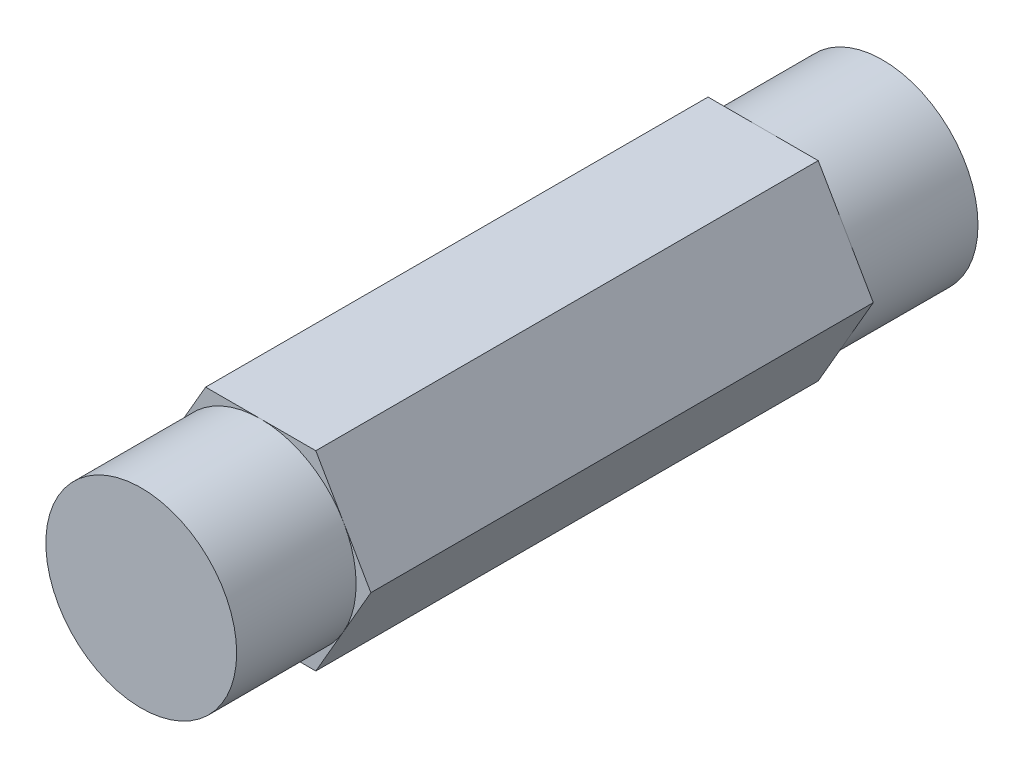
ISO-10303-21;
HEADER;
FILE_DESCRIPTION(('STEP AP214'),'2;1');
FILE_NAME('part.step','',(''),(''),'','','');
FILE_SCHEMA(('AUTOMOTIVE_DESIGN { 1 0 10303 214 1 1 1 1 }'));
ENDSEC;
DATA;
#1=APPLICATION_CONTEXT('core data for automotive mechanical design processes');
#2=APPLICATION_PROTOCOL_DEFINITION('international standard','automotive_design',2000,#1);
#3=PRODUCT_CONTEXT('',#1,'mechanical');
#4=PRODUCT('Part','Part','',(#3));
#5=PRODUCT_RELATED_PRODUCT_CATEGORY('part','',(#4));
#6=PRODUCT_DEFINITION_FORMATION('','',#4);
#7=PRODUCT_DEFINITION_CONTEXT('part definition',#1,'design');
#8=PRODUCT_DEFINITION('design','',#6,#7);
#9=PRODUCT_DEFINITION_SHAPE('','',#8);
#10=(LENGTH_UNIT() NAMED_UNIT(*) SI_UNIT(.MILLI.,.METRE.));
#11=(NAMED_UNIT(*) PLANE_ANGLE_UNIT() SI_UNIT($,.RADIAN.));
#12=(NAMED_UNIT(*) SI_UNIT($,.STERADIAN.) SOLID_ANGLE_UNIT());
#13=UNCERTAINTY_MEASURE_WITH_UNIT(LENGTH_MEASURE(1.E-05),#10,'distance_accuracy_value','');
#14=(GEOMETRIC_REPRESENTATION_CONTEXT(3) GLOBAL_UNCERTAINTY_ASSIGNED_CONTEXT((#13)) GLOBAL_UNIT_ASSIGNED_CONTEXT((#10,
#11,#12)) REPRESENTATION_CONTEXT('',''));
#15=CARTESIAN_POINT('',(0.,0.,0.));
#16=DIRECTION('',(0.,0.,1.));
#17=DIRECTION('',(1.,0.,0.));
#18=AXIS2_PLACEMENT_3D('',#15,#16,#17);
#19=CARTESIAN_POINT('',(0.,-6.35,24.66975));
#20=DIRECTION('',(0.,1.,0.));
#21=DIRECTION('',(-1.,0.,0.));
#22=AXIS2_PLACEMENT_3D('',#19,#20,#21);
#23=PLANE('',#22);
#24=DIRECTION('',(-1.,0.,0.));
#25=VECTOR('',#24,1.);
#26=CARTESIAN_POINT('',(0.,-6.35,-16.71955));
#27=LINE('',#26,#25);
#28=CARTESIAN_POINT('',(3.66617420935412,-6.35,-16.71955));
#29=VERTEX_POINT('',#28);
#30=CARTESIAN_POINT('',(0.,-6.35,-16.71955));
#31=VERTEX_POINT('',#30);
#32=EDGE_CURVE('E315',#29,#31,#27,.T.);
#33=ORIENTED_EDGE('',*,*,#32,.F.);
#34=DIRECTION('',(0.,0.,-1.));
#35=VECTOR('',#34,1.);
#36=CARTESIAN_POINT('',(3.66617420935412,-6.35,24.66975));
#37=LINE('',#36,#35);
#38=CARTESIAN_POINT('',(3.66617420935412,-6.35,16.71955));
#39=VERTEX_POINT('',#38);
#40=EDGE_CURVE('E228',#39,#29,#37,.T.);
#41=ORIENTED_EDGE('',*,*,#40,.F.);
#42=DIRECTION('',(1.,0.,0.));
#43=VECTOR('',#42,1.);
#44=CARTESIAN_POINT('',(0.,-6.35,16.71955));
#45=LINE('',#44,#43);
#46=CARTESIAN_POINT('',(0.,-6.35,16.71955));
#47=VERTEX_POINT('',#46);
#48=EDGE_CURVE('E207',#47,#39,#45,.T.);
#49=ORIENTED_EDGE('',*,*,#48,.F.);
#50=CARTESIAN_POINT('',(-3.66617420935412,-6.35,16.71955));
#51=VERTEX_POINT('',#50);
#52=EDGE_CURVE('E210',#51,#47,#45,.T.);
#53=ORIENTED_EDGE('',*,*,#52,.F.);
#54=DIRECTION('',(0.,0.,-1.));
#55=VECTOR('',#54,1.);
#56=CARTESIAN_POINT('',(-3.66617420935412,-6.35,24.66975));
#57=LINE('',#56,#55);
#58=CARTESIAN_POINT('',(-3.66617420935412,-6.35,-16.71955));
#59=VERTEX_POINT('',#58);
#60=EDGE_CURVE('E211',#51,#59,#57,.T.);
#61=ORIENTED_EDGE('',*,*,#60,.T.);
#62=EDGE_CURVE('E305',#31,#59,#27,.T.);
#63=ORIENTED_EDGE('',*,*,#62,.F.);
#64=EDGE_LOOP('',(#33,#41,#49,#53,#61,#63));
#65=FACE_BOUND('',#64,.T.);
#66=ADVANCED_FACE('F49',(#65),#23,.F.);
#67=CARTESIAN_POINT('',(5.49926131403119,-3.175,24.66975));
#68=DIRECTION('',(-0.866025403784439,0.5,0.));
#69=DIRECTION('',(-0.5,-0.866025403784439,0.));
#70=AXIS2_PLACEMENT_3D('',#67,#68,#69);
#71=PLANE('',#70);
#72=DIRECTION('',(-0.5,-0.866025403784439,0.));
#73=VECTOR('',#72,1.);
#74=CARTESIAN_POINT('',(5.49926131403119,-3.175,-16.71955));
#75=LINE('',#74,#73);
#76=CARTESIAN_POINT('',(7.33234841870825,0.,-16.71955));
#77=VERTEX_POINT('',#76);
#78=CARTESIAN_POINT('',(5.49926131403119,-3.175,-16.71955));
#79=VERTEX_POINT('',#78);
#80=EDGE_CURVE('E160',#77,#79,#75,.T.);
#81=ORIENTED_EDGE('',*,*,#80,.F.);
#82=DIRECTION('',(0.,0.,-1.));
#83=VECTOR('',#82,1.);
#84=CARTESIAN_POINT('',(7.33234841870825,0.,24.66975));
#85=LINE('',#84,#83);
#86=CARTESIAN_POINT('',(7.33234841870825,0.,16.71955));
#87=VERTEX_POINT('',#86);
#88=EDGE_CURVE('E178',#87,#77,#85,.T.);
#89=ORIENTED_EDGE('',*,*,#88,.F.);
#90=DIRECTION('',(0.5,0.866025403784439,0.));
#91=VECTOR('',#90,1.);
#92=CARTESIAN_POINT('',(5.49926131403119,-3.175,16.71955));
#93=LINE('',#92,#91);
#94=CARTESIAN_POINT('',(5.49926131403119,-3.175,16.71955));
#95=VERTEX_POINT('',#94);
#96=EDGE_CURVE('E203',#95,#87,#93,.T.);
#97=ORIENTED_EDGE('',*,*,#96,.F.);
#98=EDGE_CURVE('E206',#39,#95,#93,.T.);
#99=ORIENTED_EDGE('',*,*,#98,.F.);
#100=ORIENTED_EDGE('',*,*,#40,.T.);
#101=EDGE_CURVE('E185',#79,#29,#75,.T.);
#102=ORIENTED_EDGE('',*,*,#101,.F.);
#103=EDGE_LOOP('',(#81,#89,#97,#99,#100,#102));
#104=FACE_BOUND('',#103,.T.);
#105=ADVANCED_FACE('F326',(#104),#71,.F.);
#106=CARTESIAN_POINT('',(5.49926131403119,3.175,24.66975));
#107=DIRECTION('',(-0.866025403784439,-0.5,0.));
#108=DIRECTION('',(0.5,-0.866025403784439,0.));
#109=AXIS2_PLACEMENT_3D('',#106,#107,#108);
#110=PLANE('',#109);
#111=DIRECTION('',(0.5,-0.866025403784439,0.));
#112=VECTOR('',#111,1.);
#113=CARTESIAN_POINT('',(5.49926131403119,3.175,-16.71955));
#114=LINE('',#113,#112);
#115=CARTESIAN_POINT('',(3.66617420935412,6.35,-16.71955));
#116=VERTEX_POINT('',#115);
#117=CARTESIAN_POINT('',(5.49926131403119,3.175,-16.71955));
#118=VERTEX_POINT('',#117);
#119=EDGE_CURVE('E140',#116,#118,#114,.T.);
#120=ORIENTED_EDGE('',*,*,#119,.F.);
#121=DIRECTION('',(0.,0.,-1.));
#122=VECTOR('',#121,1.);
#123=CARTESIAN_POINT('',(3.66617420935412,6.35,24.66975));
#124=LINE('',#123,#122);
#125=CARTESIAN_POINT('',(3.66617420935412,6.35,16.71955));
#126=VERTEX_POINT('',#125);
#127=EDGE_CURVE('E223',#126,#116,#124,.T.);
#128=ORIENTED_EDGE('',*,*,#127,.F.);
#129=DIRECTION('',(-0.5,0.866025403784439,0.));
#130=VECTOR('',#129,1.);
#131=CARTESIAN_POINT('',(5.49926131403119,3.175,16.71955));
#132=LINE('',#131,#130);
#133=CARTESIAN_POINT('',(5.49926131403119,3.175,16.71955));
#134=VERTEX_POINT('',#133);
#135=EDGE_CURVE('E199',#134,#126,#132,.T.);
#136=ORIENTED_EDGE('',*,*,#135,.F.);
#137=EDGE_CURVE('E202',#87,#134,#132,.T.);
#138=ORIENTED_EDGE('',*,*,#137,.F.);
#139=ORIENTED_EDGE('',*,*,#88,.T.);
#140=EDGE_CURVE('E153',#118,#77,#114,.T.);
#141=ORIENTED_EDGE('',*,*,#140,.F.);
#142=EDGE_LOOP('',(#120,#128,#136,#138,#139,#141));
#143=FACE_BOUND('',#142,.T.);
#144=ADVANCED_FACE('F175',(#143),#110,.F.);
#145=CARTESIAN_POINT('',(0.,6.35,24.66975));
#146=DIRECTION('',(0.,-1.,0.));
#147=DIRECTION('',(1.,0.,0.));
#148=AXIS2_PLACEMENT_3D('',#145,#146,#147);
#149=PLANE('',#148);
#150=DIRECTION('',(1.,0.,0.));
#151=VECTOR('',#150,1.);
#152=CARTESIAN_POINT('',(0.,6.35,-16.71955));
#153=LINE('',#152,#151);
#154=CARTESIAN_POINT('',(-3.66617420935412,6.35,-16.71955));
#155=VERTEX_POINT('',#154);
#156=CARTESIAN_POINT('',(0.,6.35,-16.71955));
#157=VERTEX_POINT('',#156);
#158=EDGE_CURVE('E182',#155,#157,#153,.T.);
#159=ORIENTED_EDGE('',*,*,#158,.F.);
#160=DIRECTION('',(0.,0.,-1.));
#161=VECTOR('',#160,1.);
#162=CARTESIAN_POINT('',(-3.66617420935412,6.35,24.66975));
#163=LINE('',#162,#161);
#164=CARTESIAN_POINT('',(-3.66617420935412,6.35,16.71955));
#165=VERTEX_POINT('',#164);
#166=EDGE_CURVE('E219',#165,#155,#163,.T.);
#167=ORIENTED_EDGE('',*,*,#166,.F.);
#168=DIRECTION('',(-1.,0.,0.));
#169=VECTOR('',#168,1.);
#170=CARTESIAN_POINT('',(0.,6.35,16.71955));
#171=LINE('',#170,#169);
#172=CARTESIAN_POINT('',(0.,6.35,16.71955));
#173=VERTEX_POINT('',#172);
#174=EDGE_CURVE('E195',#173,#165,#171,.T.);
#175=ORIENTED_EDGE('',*,*,#174,.F.);
#176=EDGE_CURVE('E198',#126,#173,#171,.T.);
#177=ORIENTED_EDGE('',*,*,#176,.F.);
#178=ORIENTED_EDGE('',*,*,#127,.T.);
#179=EDGE_CURVE('E146',#157,#116,#153,.T.);
#180=ORIENTED_EDGE('',*,*,#179,.F.);
#181=EDGE_LOOP('',(#159,#167,#175,#177,#178,#180));
#182=FACE_BOUND('',#181,.T.);
#183=ADVANCED_FACE('F293',(#182),#149,.F.);
#184=CARTESIAN_POINT('',(-5.49926131403118,3.175,24.66975));
#185=DIRECTION('',(0.866025403784439,-0.5,0.));
#186=DIRECTION('',(0.5,0.866025403784439,0.));
#187=AXIS2_PLACEMENT_3D('',#184,#185,#186);
#188=PLANE('',#187);
#189=DIRECTION('',(0.5,0.866025403784439,0.));
#190=VECTOR('',#189,1.);
#191=CARTESIAN_POINT('',(-5.49926131403118,3.175,-16.71955));
#192=LINE('',#191,#190);
#193=CARTESIAN_POINT('',(-7.33234841870824,0.,-16.71955));
#194=VERTEX_POINT('',#193);
#195=CARTESIAN_POINT('',(-5.49926131403119,3.175,-16.71955));
#196=VERTEX_POINT('',#195);
#197=EDGE_CURVE('E173',#194,#196,#192,.T.);
#198=ORIENTED_EDGE('',*,*,#197,.F.);
#199=DIRECTION('',(0.,0.,-1.));
#200=VECTOR('',#199,1.);
#201=CARTESIAN_POINT('',(-7.33234841870824,0.,24.66975));
#202=LINE('',#201,#200);
#203=CARTESIAN_POINT('',(-7.33234841870824,0.,16.71955));
#204=VERTEX_POINT('',#203);
#205=EDGE_CURVE('E215',#204,#194,#202,.T.);
#206=ORIENTED_EDGE('',*,*,#205,.F.);
#207=DIRECTION('',(-0.5,-0.866025403784439,0.));
#208=VECTOR('',#207,1.);
#209=CARTESIAN_POINT('',(-5.49926131403118,3.175,16.71955));
#210=LINE('',#209,#208);
#211=CARTESIAN_POINT('',(-5.49926131403119,3.175,16.71955));
#212=VERTEX_POINT('',#211);
#213=EDGE_CURVE('E190',#212,#204,#210,.T.);
#214=ORIENTED_EDGE('',*,*,#213,.F.);
#215=EDGE_CURVE('E194',#165,#212,#210,.T.);
#216=ORIENTED_EDGE('',*,*,#215,.F.);
#217=ORIENTED_EDGE('',*,*,#166,.T.);
#218=EDGE_CURVE('E307',#196,#155,#192,.T.);
#219=ORIENTED_EDGE('',*,*,#218,.F.);
#220=EDGE_LOOP('',(#198,#206,#214,#216,#217,#219));
#221=FACE_BOUND('',#220,.T.);
#222=ADVANCED_FACE('F300',(#221),#188,.F.);
#223=CARTESIAN_POINT('',(-5.49926131403118,-3.175,24.66975));
#224=DIRECTION('',(0.866025403784439,0.5,0.));
#225=DIRECTION('',(-0.5,0.866025403784439,0.));
#226=AXIS2_PLACEMENT_3D('',#223,#224,#225);
#227=PLANE('',#226);
#228=DIRECTION('',(-0.5,0.866025403784439,0.));
#229=VECTOR('',#228,1.);
#230=CARTESIAN_POINT('',(-5.49926131403118,-3.175,-16.71955));
#231=LINE('',#230,#229);
#232=CARTESIAN_POINT('',(-5.49926131403118,-3.175,-16.71955));
#233=VERTEX_POINT('',#232);
#234=EDGE_CURVE('E12',#59,#233,#231,.T.);
#235=ORIENTED_EDGE('',*,*,#234,.F.);
#236=ORIENTED_EDGE('',*,*,#60,.F.);
#237=DIRECTION('',(0.5,-0.866025403784439,0.));
#238=VECTOR('',#237,1.);
#239=CARTESIAN_POINT('',(-5.49926131403118,-3.175,16.71955));
#240=LINE('',#239,#238);
#241=CARTESIAN_POINT('',(-5.49926131403118,-3.175,16.71955));
#242=VERTEX_POINT('',#241);
#243=EDGE_CURVE('E236',#242,#51,#240,.T.);
#244=ORIENTED_EDGE('',*,*,#243,.F.);
#245=EDGE_CURVE('E238',#204,#242,#240,.T.);
#246=ORIENTED_EDGE('',*,*,#245,.F.);
#247=ORIENTED_EDGE('',*,*,#205,.T.);
#248=EDGE_CURVE('E52',#233,#194,#231,.T.);
#249=ORIENTED_EDGE('',*,*,#248,.F.);
#250=EDGE_LOOP('',(#235,#236,#244,#246,#247,#249));
#251=FACE_BOUND('',#250,.T.);
#252=ADVANCED_FACE('F256',(#251),#227,.F.);
#253=CARTESIAN_POINT('',(0.,0.,16.71955));
#254=DIRECTION('',(0.,0.,1.));
#255=DIRECTION('',(1.,0.,0.));
#256=AXIS2_PLACEMENT_3D('',#253,#254,#255);
#257=PLANE('',#256);
#258=ORIENTED_EDGE('',*,*,#52,.T.);
#259=CARTESIAN_POINT('',(0.,0.,16.71955));
#260=DIRECTION('',(0.,0.,1.));
#261=DIRECTION('',(1.,0.,0.));
#262=AXIS2_PLACEMENT_3D('',#259,#260,#261);
#263=CIRCLE('',#262,6.35);
#264=EDGE_CURVE('E261',#242,#47,#263,.T.);
#265=ORIENTED_EDGE('',*,*,#264,.F.);
#266=ORIENTED_EDGE('',*,*,#243,.T.);
#267=EDGE_LOOP('',(#258,#265,#266));
#268=FACE_BOUND('',#267,.T.);
#269=ADVANCED_FACE('F259',(#268),#257,.T.);
#270=ORIENTED_EDGE('',*,*,#48,.T.);
#271=ORIENTED_EDGE('',*,*,#98,.T.);
#272=EDGE_CURVE('E276',#47,#95,#263,.T.);
#273=ORIENTED_EDGE('',*,*,#272,.F.);
#274=EDGE_LOOP('',(#270,#271,#273));
#275=FACE_BOUND('',#274,.T.);
#276=ADVANCED_FACE('F328',(#275),#257,.T.);
#277=ORIENTED_EDGE('',*,*,#96,.T.);
#278=ORIENTED_EDGE('',*,*,#137,.T.);
#279=EDGE_CURVE('E152',#95,#134,#263,.T.);
#280=ORIENTED_EDGE('',*,*,#279,.F.);
#281=EDGE_LOOP('',(#277,#278,#280));
#282=FACE_BOUND('',#281,.T.);
#283=ADVANCED_FACE('F330',(#282),#257,.T.);
#284=ORIENTED_EDGE('',*,*,#135,.T.);
#285=ORIENTED_EDGE('',*,*,#176,.T.);
#286=EDGE_CURVE('E186',#134,#173,#263,.T.);
#287=ORIENTED_EDGE('',*,*,#286,.F.);
#288=EDGE_LOOP('',(#284,#285,#287));
#289=FACE_BOUND('',#288,.T.);
#290=ADVANCED_FACE('F288',(#289),#257,.T.);
#291=ORIENTED_EDGE('',*,*,#174,.T.);
#292=ORIENTED_EDGE('',*,*,#215,.T.);
#293=EDGE_CURVE('E191',#173,#212,#263,.T.);
#294=ORIENTED_EDGE('',*,*,#293,.F.);
#295=EDGE_LOOP('',(#291,#292,#294));
#296=FACE_BOUND('',#295,.T.);
#297=ADVANCED_FACE('F297',(#296),#257,.T.);
#298=ORIENTED_EDGE('',*,*,#213,.T.);
#299=ORIENTED_EDGE('',*,*,#245,.T.);
#300=EDGE_CURVE('E72',#212,#242,#263,.T.);
#301=ORIENTED_EDGE('',*,*,#300,.F.);
#302=EDGE_LOOP('',(#298,#299,#301));
#303=FACE_BOUND('',#302,.T.);
#304=ADVANCED_FACE('F250',(#303),#257,.T.);
#305=CARTESIAN_POINT('',(0.,0.,16.71955));
#306=DIRECTION('',(0.,0.,1.));
#307=DIRECTION('',(1.,0.,0.));
#308=AXIS2_PLACEMENT_3D('',#305,#306,#307);
#309=CYLINDRICAL_SURFACE('',#308,6.35);
#310=CARTESIAN_POINT('',(0.,0.,24.66975));
#311=DIRECTION('',(0.,0.,1.));
#312=DIRECTION('',(1.,0.,0.));
#313=AXIS2_PLACEMENT_3D('',#310,#311,#312);
#314=CIRCLE('',#313,6.35);
#315=CARTESIAN_POINT('',(6.35,0.,24.66975));
#316=VERTEX_POINT('',#315);
#317=EDGE_CURVE('E232',#316,#316,#314,.T.);
#318=ORIENTED_EDGE('',*,*,#317,.F.);
#319=EDGE_LOOP('',(#318));
#320=FACE_BOUND('',#319,.T.);
#321=ORIENTED_EDGE('',*,*,#264,.T.);
#322=ORIENTED_EDGE('',*,*,#272,.T.);
#323=ORIENTED_EDGE('',*,*,#279,.T.);
#324=ORIENTED_EDGE('',*,*,#286,.T.);
#325=ORIENTED_EDGE('',*,*,#293,.T.);
#326=ORIENTED_EDGE('',*,*,#300,.T.);
#327=EDGE_LOOP('',(#321,#322,#323,#324,#325,#326));
#328=FACE_BOUND('',#327,.T.);
#329=ADVANCED_FACE('F282',(#320,#328),#309,.T.);
#330=CARTESIAN_POINT('',(0.,0.,24.66975));
#331=DIRECTION('',(0.,0.,1.));
#332=DIRECTION('',(1.,0.,0.));
#333=AXIS2_PLACEMENT_3D('',#330,#331,#332);
#334=PLANE('',#333);
#335=ORIENTED_EDGE('',*,*,#317,.T.);
#336=EDGE_LOOP('',(#335));
#337=FACE_BOUND('',#336,.T.);
#338=ADVANCED_FACE('F356',(#337),#334,.T.);
#339=CARTESIAN_POINT('',(0.,0.,-16.71955));
#340=DIRECTION('',(0.,0.,-1.));
#341=DIRECTION('',(-1.,0.,0.));
#342=AXIS2_PLACEMENT_3D('',#339,#340,#341);
#343=PLANE('',#342);
#344=ORIENTED_EDGE('',*,*,#119,.T.);
#345=CARTESIAN_POINT('',(0.,0.,-16.71955));
#346=DIRECTION('',(0.,0.,1.));
#347=DIRECTION('',(1.,0.,0.));
#348=AXIS2_PLACEMENT_3D('',#345,#346,#347);
#349=CIRCLE('',#348,6.35);
#350=EDGE_CURVE('E144',#118,#157,#349,.T.);
#351=ORIENTED_EDGE('',*,*,#350,.T.);
#352=ORIENTED_EDGE('',*,*,#179,.T.);
#353=EDGE_LOOP('',(#344,#351,#352));
#354=FACE_BOUND('',#353,.T.);
#355=ADVANCED_FACE('F142',(#354),#343,.T.);
#356=ORIENTED_EDGE('',*,*,#140,.T.);
#357=ORIENTED_EDGE('',*,*,#80,.T.);
#358=EDGE_CURVE('E157',#79,#118,#349,.T.);
#359=ORIENTED_EDGE('',*,*,#358,.T.);
#360=EDGE_LOOP('',(#356,#357,#359));
#361=FACE_BOUND('',#360,.T.);
#362=ADVANCED_FACE('F158',(#361),#343,.T.);
#363=ORIENTED_EDGE('',*,*,#101,.T.);
#364=ORIENTED_EDGE('',*,*,#32,.T.);
#365=EDGE_CURVE('E165',#31,#79,#349,.T.);
#366=ORIENTED_EDGE('',*,*,#365,.T.);
#367=EDGE_LOOP('',(#363,#364,#366));
#368=FACE_BOUND('',#367,.T.);
#369=ADVANCED_FACE('F379',(#368),#343,.T.);
#370=ORIENTED_EDGE('',*,*,#158,.T.);
#371=EDGE_CURVE('E171',#157,#196,#349,.T.);
#372=ORIENTED_EDGE('',*,*,#371,.T.);
#373=ORIENTED_EDGE('',*,*,#218,.T.);
#374=EDGE_LOOP('',(#370,#372,#373));
#375=FACE_BOUND('',#374,.T.);
#376=ADVANCED_FACE('F312',(#375),#343,.T.);
#377=ORIENTED_EDGE('',*,*,#62,.T.);
#378=ORIENTED_EDGE('',*,*,#234,.T.);
#379=EDGE_CURVE('E309',#233,#31,#349,.T.);
#380=ORIENTED_EDGE('',*,*,#379,.T.);
#381=EDGE_LOOP('',(#377,#378,#380));
#382=FACE_BOUND('',#381,.T.);
#383=ADVANCED_FACE('F321',(#382),#343,.T.);
#384=ORIENTED_EDGE('',*,*,#197,.T.);
#385=EDGE_CURVE('E64',#196,#233,#349,.T.);
#386=ORIENTED_EDGE('',*,*,#385,.T.);
#387=ORIENTED_EDGE('',*,*,#248,.T.);
#388=EDGE_LOOP('',(#384,#386,#387));
#389=FACE_BOUND('',#388,.T.);
#390=ADVANCED_FACE('F303',(#389),#343,.T.);
#391=CARTESIAN_POINT('',(0.,0.,-16.71955));
#392=DIRECTION('',(0.,0.,-1.));
#393=DIRECTION('',(-1.,0.,0.));
#394=AXIS2_PLACEMENT_3D('',#391,#392,#393);
#395=CYLINDRICAL_SURFACE('',#394,6.35);
#396=ORIENTED_EDGE('',*,*,#365,.F.);
#397=ORIENTED_EDGE('',*,*,#379,.F.);
#398=ORIENTED_EDGE('',*,*,#385,.F.);
#399=ORIENTED_EDGE('',*,*,#371,.F.);
#400=ORIENTED_EDGE('',*,*,#350,.F.);
#401=ORIENTED_EDGE('',*,*,#358,.F.);
#402=EDGE_LOOP('',(#396,#397,#398,#399,#400,#401));
#403=FACE_BOUND('',#402,.T.);
#404=CARTESIAN_POINT('',(0.,0.,-24.66975));
#405=DIRECTION('',(0.,0.,1.));
#406=DIRECTION('',(1.,0.,0.));
#407=AXIS2_PLACEMENT_3D('',#404,#405,#406);
#408=CIRCLE('',#407,6.35);
#409=CARTESIAN_POINT('',(6.35,0.,-24.66975));
#410=VERTEX_POINT('',#409);
#411=EDGE_CURVE('E239',#410,#410,#408,.F.);
#412=ORIENTED_EDGE('',*,*,#411,.F.);
#413=EDGE_LOOP('',(#412));
#414=FACE_BOUND('',#413,.T.);
#415=ADVANCED_FACE('F168',(#403,#414),#395,.T.);
#416=CARTESIAN_POINT('',(0.,0.,-24.66975));
#417=DIRECTION('',(0.,0.,1.));
#418=DIRECTION('',(1.,0.,0.));
#419=AXIS2_PLACEMENT_3D('',#416,#417,#418);
#420=PLANE('',#419);
#421=ORIENTED_EDGE('',*,*,#411,.T.);
#422=EDGE_LOOP('',(#421));
#423=FACE_BOUND('',#422,.T.);
#424=ADVANCED_FACE('F354',(#423),#420,.F.);
#425=CLOSED_SHELL('',(#66,#105,#144,#183,#222,#252,#269,#276,#283,#290,#297,#304,#329,#338,#355,
#362,#369,#376,#383,#390,#415,#424));
#426=MANIFOLD_SOLID_BREP('B2',#425);
#427=ADVANCED_BREP_SHAPE_REPRESENTATION('',(#18,#426),#14);
#428=SHAPE_DEFINITION_REPRESENTATION(#9,#427);
ENDSEC;
END-ISO-10303-21;
